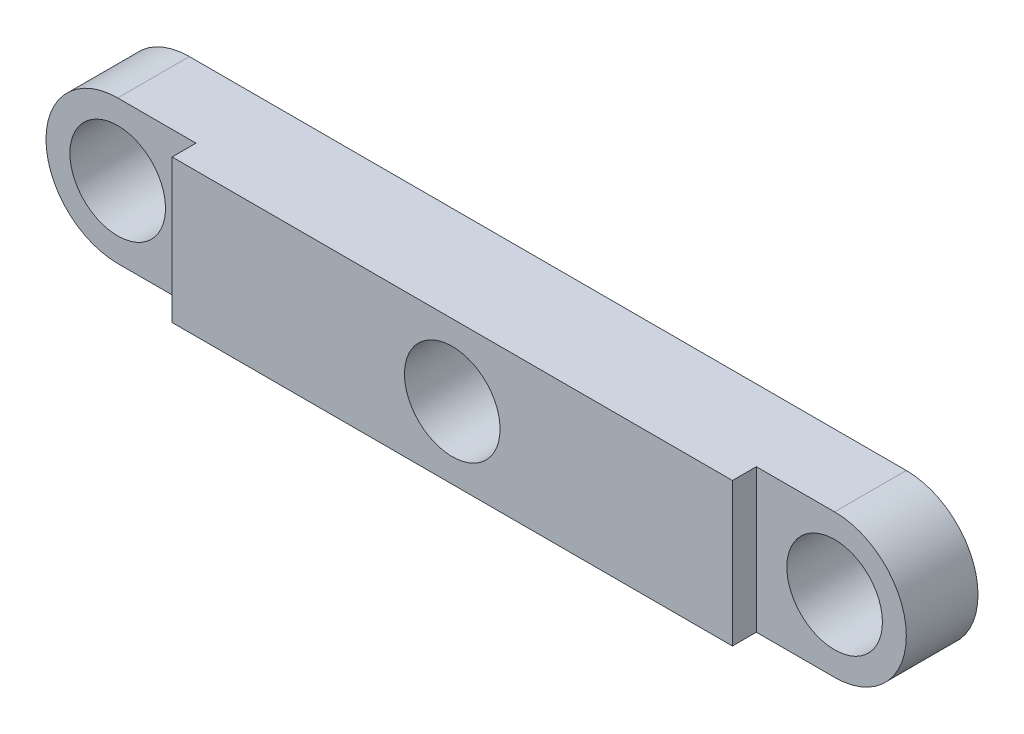
ISO-10303-21;
HEADER;
FILE_DESCRIPTION(('STEP AP214'),'2;1');
FILE_NAME('part.step','',(''),(''),'','','');
FILE_SCHEMA(('AUTOMOTIVE_DESIGN { 1 0 10303 214 1 1 1 1 }'));
ENDSEC;
DATA;
#1=APPLICATION_CONTEXT('core data for automotive mechanical design processes');
#2=APPLICATION_PROTOCOL_DEFINITION('international standard','automotive_design',2000,#1);
#3=PRODUCT_CONTEXT('',#1,'mechanical');
#4=PRODUCT('Part','Part','',(#3));
#5=PRODUCT_RELATED_PRODUCT_CATEGORY('part','',(#4));
#6=PRODUCT_DEFINITION_FORMATION('','',#4);
#7=PRODUCT_DEFINITION_CONTEXT('part definition',#1,'design');
#8=PRODUCT_DEFINITION('design','',#6,#7);
#9=PRODUCT_DEFINITION_SHAPE('','',#8);
#10=(LENGTH_UNIT() NAMED_UNIT(*) SI_UNIT(.MILLI.,.METRE.));
#11=(NAMED_UNIT(*) PLANE_ANGLE_UNIT() SI_UNIT($,.RADIAN.));
#12=(NAMED_UNIT(*) SI_UNIT($,.STERADIAN.) SOLID_ANGLE_UNIT());
#13=UNCERTAINTY_MEASURE_WITH_UNIT(LENGTH_MEASURE(1.E-05),#10,'distance_accuracy_value','');
#14=(GEOMETRIC_REPRESENTATION_CONTEXT(3) GLOBAL_UNCERTAINTY_ASSIGNED_CONTEXT((#13)) GLOBAL_UNIT_ASSIGNED_CONTEXT((#10,
#11,#12)) REPRESENTATION_CONTEXT('',''));
#15=CARTESIAN_POINT('',(0.,0.,0.));
#16=DIRECTION('',(0.,0.,1.));
#17=DIRECTION('',(1.,0.,0.));
#18=AXIS2_PLACEMENT_3D('',#15,#16,#17);
#19=CARTESIAN_POINT('',(75.,0.,10.));
#20=DIRECTION('',(0.,0.,-1.));
#21=DIRECTION('',(-1.,0.,0.));
#22=AXIS2_PLACEMENT_3D('',#19,#20,#21);
#23=CYLINDRICAL_SURFACE('',#22,15.);
#24=CARTESIAN_POINT('',(75.,0.,5.));
#25=DIRECTION('',(0.,0.,1.));
#26=DIRECTION('',(1.,0.,0.));
#27=AXIS2_PLACEMENT_3D('',#24,#25,#26);
#28=CIRCLE('',#27,15.);
#29=CARTESIAN_POINT('',(75.,-15.,5.));
#30=VERTEX_POINT('',#29);
#31=CARTESIAN_POINT('',(75.,15.,5.));
#32=VERTEX_POINT('',#31);
#33=EDGE_CURVE('E68',#30,#32,#28,.T.);
#34=ORIENTED_EDGE('',*,*,#33,.F.);
#35=DIRECTION('',(0.,0.,-1.));
#36=VECTOR('',#35,1.);
#37=CARTESIAN_POINT('',(75.,-15.,10.));
#38=LINE('',#37,#36);
#39=CARTESIAN_POINT('',(75.,-15.,-10.));
#40=VERTEX_POINT('',#39);
#41=EDGE_CURVE('E52',#30,#40,#38,.T.);
#42=ORIENTED_EDGE('',*,*,#41,.T.);
#43=CARTESIAN_POINT('',(75.,0.,-10.));
#44=DIRECTION('',(0.,0.,1.));
#45=DIRECTION('',(1.,0.,0.));
#46=AXIS2_PLACEMENT_3D('',#43,#44,#45);
#47=CIRCLE('',#46,15.);
#48=CARTESIAN_POINT('',(75.,15.,-10.));
#49=VERTEX_POINT('',#48);
#50=EDGE_CURVE('E174',#40,#49,#47,.T.);
#51=ORIENTED_EDGE('',*,*,#50,.T.);
#52=DIRECTION('',(0.,0.,-1.));
#53=VECTOR('',#52,1.);
#54=CARTESIAN_POINT('',(75.,15.,10.));
#55=LINE('',#54,#53);
#56=EDGE_CURVE('E180',#32,#49,#55,.T.);
#57=ORIENTED_EDGE('',*,*,#56,.F.);
#58=EDGE_LOOP('',(#34,#42,#51,#57));
#59=FACE_BOUND('',#58,.T.);
#60=ADVANCED_FACE('F43',(#59),#23,.T.);
#61=CARTESIAN_POINT('',(75.,0.,10.));
#62=DIRECTION('',(0.,0.,-1.));
#63=DIRECTION('',(-1.,0.,0.));
#64=AXIS2_PLACEMENT_3D('',#61,#62,#63);
#65=CYLINDRICAL_SURFACE('',#64,10.);
#66=CARTESIAN_POINT('',(75.,0.,-10.));
#67=DIRECTION('',(0.,0.,1.));
#68=DIRECTION('',(1.,0.,0.));
#69=AXIS2_PLACEMENT_3D('',#66,#67,#68);
#70=CIRCLE('',#69,10.);
#71=CARTESIAN_POINT('',(85.,0.,-10.));
#72=VERTEX_POINT('',#71);
#73=EDGE_CURVE('E150',#72,#72,#70,.T.);
#74=ORIENTED_EDGE('',*,*,#73,.F.);
#75=EDGE_LOOP('',(#74));
#76=FACE_BOUND('',#75,.T.);
#77=CARTESIAN_POINT('',(75.,0.,5.));
#78=DIRECTION('',(0.,0.,1.));
#79=DIRECTION('',(1.,0.,0.));
#80=AXIS2_PLACEMENT_3D('',#77,#78,#79);
#81=CIRCLE('',#80,10.);
#82=CARTESIAN_POINT('',(85.,0.,5.));
#83=VERTEX_POINT('',#82);
#84=EDGE_CURVE('E130',#83,#83,#81,.T.);
#85=ORIENTED_EDGE('',*,*,#84,.T.);
#86=EDGE_LOOP('',(#85));
#87=FACE_BOUND('',#86,.T.);
#88=ADVANCED_FACE('F185',(#76,#87),#65,.F.);
#89=CARTESIAN_POINT('',(-75.,0.,10.));
#90=DIRECTION('',(0.,0.,1.));
#91=DIRECTION('',(1.,0.,0.));
#92=AXIS2_PLACEMENT_3D('',#89,#90,#91);
#93=PLANE('',#92);
#94=DIRECTION('',(0.,1.,0.));
#95=VECTOR('',#94,1.);
#96=CARTESIAN_POINT('',(-58.6201110809115,15.,10.));
#97=LINE('',#96,#95);
#98=CARTESIAN_POINT('',(-58.6201110809115,-15.,10.));
#99=VERTEX_POINT('',#98);
#100=CARTESIAN_POINT('',(-58.6201110809115,15.,10.));
#101=VERTEX_POINT('',#100);
#102=EDGE_CURVE('E146',#99,#101,#97,.T.);
#103=ORIENTED_EDGE('',*,*,#102,.F.);
#104=DIRECTION('',(1.,0.,0.));
#105=VECTOR('',#104,1.);
#106=CARTESIAN_POINT('',(-75.,-15.,10.));
#107=LINE('',#106,#105);
#108=CARTESIAN_POINT('',(58.6201110809014,-15.,10.));
#109=VERTEX_POINT('',#108);
#110=EDGE_CURVE('E128',#99,#109,#107,.T.);
#111=ORIENTED_EDGE('',*,*,#110,.T.);
#112=DIRECTION('',(0.,-1.,0.));
#113=VECTOR('',#112,1.);
#114=CARTESIAN_POINT('',(58.6201110809014,15.,10.));
#115=LINE('',#114,#113);
#116=CARTESIAN_POINT('',(58.6201110809014,15.,10.));
#117=VERTEX_POINT('',#116);
#118=EDGE_CURVE('E137',#117,#109,#115,.T.);
#119=ORIENTED_EDGE('',*,*,#118,.F.);
#120=DIRECTION('',(-1.,0.,0.));
#121=VECTOR('',#120,1.);
#122=CARTESIAN_POINT('',(-75.,15.,10.));
#123=LINE('',#122,#121);
#124=EDGE_CURVE('E164',#117,#101,#123,.T.);
#125=ORIENTED_EDGE('',*,*,#124,.T.);
#126=EDGE_LOOP('',(#103,#111,#119,#125));
#127=FACE_BOUND('',#126,.T.);
#128=CARTESIAN_POINT('',(0.,0.,10.));
#129=DIRECTION('',(0.,0.,1.));
#130=DIRECTION('',(1.,0.,0.));
#131=AXIS2_PLACEMENT_3D('',#128,#129,#130);
#132=CIRCLE('',#131,10.);
#133=CARTESIAN_POINT('',(10.,0.,10.));
#134=VERTEX_POINT('',#133);
#135=EDGE_CURVE('E154',#134,#134,#132,.T.);
#136=ORIENTED_EDGE('',*,*,#135,.F.);
#137=EDGE_LOOP('',(#136));
#138=FACE_BOUND('',#137,.T.);
#139=ADVANCED_FACE('F210',(#127,#138),#93,.T.);
#140=CARTESIAN_POINT('',(-75.,0.,-10.));
#141=DIRECTION('',(0.,0.,1.));
#142=DIRECTION('',(1.,0.,0.));
#143=AXIS2_PLACEMENT_3D('',#140,#141,#142);
#144=PLANE('',#143);
#145=CARTESIAN_POINT('',(-75.,0.,-10.));
#146=DIRECTION('',(0.,0.,1.));
#147=DIRECTION('',(1.,0.,0.));
#148=AXIS2_PLACEMENT_3D('',#145,#146,#147);
#149=CIRCLE('',#148,15.);
#150=CARTESIAN_POINT('',(-75.,15.,-10.));
#151=VERTEX_POINT('',#150);
#152=CARTESIAN_POINT('',(-75.,-15.,-10.));
#153=VERTEX_POINT('',#152);
#154=EDGE_CURVE('E162',#151,#153,#149,.T.);
#155=ORIENTED_EDGE('',*,*,#154,.F.);
#156=DIRECTION('',(-1.,0.,0.));
#157=VECTOR('',#156,1.);
#158=CARTESIAN_POINT('',(-75.,15.,-10.));
#159=LINE('',#158,#157);
#160=EDGE_CURVE('E165',#49,#151,#159,.T.);
#161=ORIENTED_EDGE('',*,*,#160,.F.);
#162=ORIENTED_EDGE('',*,*,#50,.F.);
#163=DIRECTION('',(1.,0.,0.));
#164=VECTOR('',#163,1.);
#165=CARTESIAN_POINT('',(-75.,-15.,-10.));
#166=LINE('',#165,#164);
#167=EDGE_CURVE('E171',#153,#40,#166,.T.);
#168=ORIENTED_EDGE('',*,*,#167,.F.);
#169=EDGE_LOOP('',(#155,#161,#162,#168));
#170=FACE_BOUND('',#169,.T.);
#171=CARTESIAN_POINT('',(-75.,0.,-10.));
#172=DIRECTION('',(0.,0.,1.));
#173=DIRECTION('',(1.,0.,0.));
#174=AXIS2_PLACEMENT_3D('',#171,#172,#173);
#175=CIRCLE('',#174,9.99999999999999);
#176=CARTESIAN_POINT('',(-65.,0.,-10.));
#177=VERTEX_POINT('',#176);
#178=EDGE_CURVE('E157',#177,#177,#175,.T.);
#179=ORIENTED_EDGE('',*,*,#178,.T.);
#180=EDGE_LOOP('',(#179));
#181=FACE_BOUND('',#180,.T.);
#182=CARTESIAN_POINT('',(0.,0.,-10.));
#183=DIRECTION('',(0.,0.,1.));
#184=DIRECTION('',(1.,0.,0.));
#185=AXIS2_PLACEMENT_3D('',#182,#183,#184);
#186=CIRCLE('',#185,10.);
#187=CARTESIAN_POINT('',(10.,0.,-10.));
#188=VERTEX_POINT('',#187);
#189=EDGE_CURVE('E153',#188,#188,#186,.T.);
#190=ORIENTED_EDGE('',*,*,#189,.T.);
#191=EDGE_LOOP('',(#190));
#192=FACE_BOUND('',#191,.T.);
#193=ORIENTED_EDGE('',*,*,#73,.T.);
#194=EDGE_LOOP('',(#193));
#195=FACE_BOUND('',#194,.T.);
#196=ADVANCED_FACE('F222',(#170,#181,#192,#195),#144,.F.);
#197=CARTESIAN_POINT('',(-75.,0.,10.));
#198=DIRECTION('',(0.,0.,-1.));
#199=DIRECTION('',(-1.,0.,0.));
#200=AXIS2_PLACEMENT_3D('',#197,#198,#199);
#201=CYLINDRICAL_SURFACE('',#200,15.);
#202=DIRECTION('',(0.,0.,-1.));
#203=VECTOR('',#202,1.);
#204=CARTESIAN_POINT('',(-75.,-15.,10.));
#205=LINE('',#204,#203);
#206=CARTESIAN_POINT('',(-75.,-15.,5.));
#207=VERTEX_POINT('',#206);
#208=EDGE_CURVE('E11',#207,#153,#205,.T.);
#209=ORIENTED_EDGE('',*,*,#208,.F.);
#210=CARTESIAN_POINT('',(-75.,0.,5.));
#211=DIRECTION('',(0.,0.,-1.));
#212=DIRECTION('',(-1.,0.,0.));
#213=AXIS2_PLACEMENT_3D('',#210,#211,#212);
#214=CIRCLE('',#213,15.);
#215=CARTESIAN_POINT('',(-75.,15.,5.));
#216=VERTEX_POINT('',#215);
#217=EDGE_CURVE('E110',#207,#216,#214,.T.);
#218=ORIENTED_EDGE('',*,*,#217,.T.);
#219=DIRECTION('',(0.,0.,-1.));
#220=VECTOR('',#219,1.);
#221=CARTESIAN_POINT('',(-75.,15.,10.));
#222=LINE('',#221,#220);
#223=EDGE_CURVE('E168',#216,#151,#222,.T.);
#224=ORIENTED_EDGE('',*,*,#223,.T.);
#225=ORIENTED_EDGE('',*,*,#154,.T.);
#226=EDGE_LOOP('',(#209,#218,#224,#225));
#227=FACE_BOUND('',#226,.T.);
#228=ADVANCED_FACE('F45',(#227),#201,.T.);
#229=CARTESIAN_POINT('',(-75.,-15.,10.));
#230=DIRECTION('',(0.,1.,0.));
#231=DIRECTION('',(0.,0.,1.));
#232=AXIS2_PLACEMENT_3D('',#229,#230,#231);
#233=PLANE('',#232);
#234=ORIENTED_EDGE('',*,*,#110,.F.);
#235=DIRECTION('',(0.,0.,1.));
#236=VECTOR('',#235,1.);
#237=CARTESIAN_POINT('',(-58.6201110809115,-15.,5.));
#238=LINE('',#237,#236);
#239=CARTESIAN_POINT('',(-58.6201110809115,-15.,5.));
#240=VERTEX_POINT('',#239);
#241=EDGE_CURVE('E118',#240,#99,#238,.T.);
#242=ORIENTED_EDGE('',*,*,#241,.F.);
#243=DIRECTION('',(1.,0.,0.));
#244=VECTOR('',#243,1.);
#245=CARTESIAN_POINT('',(-58.6201110809115,-15.,5.));
#246=LINE('',#245,#244);
#247=EDGE_CURVE('E107',#207,#240,#246,.T.);
#248=ORIENTED_EDGE('',*,*,#247,.F.);
#249=ORIENTED_EDGE('',*,*,#208,.T.);
#250=ORIENTED_EDGE('',*,*,#167,.T.);
#251=ORIENTED_EDGE('',*,*,#41,.F.);
#252=DIRECTION('',(1.,0.,0.));
#253=VECTOR('',#252,1.);
#254=CARTESIAN_POINT('',(58.6201110809014,-15.,5.));
#255=LINE('',#254,#253);
#256=CARTESIAN_POINT('',(58.6201110809014,-15.,5.));
#257=VERTEX_POINT('',#256);
#258=EDGE_CURVE('E140',#257,#30,#255,.T.);
#259=ORIENTED_EDGE('',*,*,#258,.F.);
#260=DIRECTION('',(0.,0.,1.));
#261=VECTOR('',#260,1.);
#262=CARTESIAN_POINT('',(58.6201110809014,-15.,5.));
#263=LINE('',#262,#261);
#264=EDGE_CURVE('E144',#257,#109,#263,.T.);
#265=ORIENTED_EDGE('',*,*,#264,.T.);
#266=EDGE_LOOP('',(#234,#242,#248,#249,#250,#251,#259,#265));
#267=FACE_BOUND('',#266,.T.);
#268=ADVANCED_FACE('F125',(#267),#233,.F.);
#269=CARTESIAN_POINT('',(-75.,15.,10.));
#270=DIRECTION('',(0.,-1.,0.));
#271=DIRECTION('',(0.,0.,-1.));
#272=AXIS2_PLACEMENT_3D('',#269,#270,#271);
#273=PLANE('',#272);
#274=DIRECTION('',(-1.,0.,0.));
#275=VECTOR('',#274,1.);
#276=CARTESIAN_POINT('',(-93.8799027763311,15.,5.));
#277=LINE('',#276,#275);
#278=CARTESIAN_POINT('',(-58.6201110809115,15.,5.));
#279=VERTEX_POINT('',#278);
#280=EDGE_CURVE('E114',#279,#216,#277,.T.);
#281=ORIENTED_EDGE('',*,*,#280,.F.);
#282=DIRECTION('',(0.,0.,1.));
#283=VECTOR('',#282,1.);
#284=CARTESIAN_POINT('',(-58.6201110809115,15.,5.));
#285=LINE('',#284,#283);
#286=EDGE_CURVE('E121',#279,#101,#285,.T.);
#287=ORIENTED_EDGE('',*,*,#286,.T.);
#288=ORIENTED_EDGE('',*,*,#124,.F.);
#289=DIRECTION('',(0.,0.,1.));
#290=VECTOR('',#289,1.);
#291=CARTESIAN_POINT('',(58.6201110809014,15.,5.));
#292=LINE('',#291,#290);
#293=CARTESIAN_POINT('',(58.6201110809014,15.,5.));
#294=VERTEX_POINT('',#293);
#295=EDGE_CURVE('E142',#294,#117,#292,.T.);
#296=ORIENTED_EDGE('',*,*,#295,.F.);
#297=DIRECTION('',(-1.,0.,0.));
#298=VECTOR('',#297,1.);
#299=CARTESIAN_POINT('',(93.879902776321,15.,5.));
#300=LINE('',#299,#298);
#301=EDGE_CURVE('E134',#32,#294,#300,.T.);
#302=ORIENTED_EDGE('',*,*,#301,.F.);
#303=ORIENTED_EDGE('',*,*,#56,.T.);
#304=ORIENTED_EDGE('',*,*,#160,.T.);
#305=ORIENTED_EDGE('',*,*,#223,.F.);
#306=EDGE_LOOP('',(#281,#287,#288,#296,#302,#303,#304,#305));
#307=FACE_BOUND('',#306,.T.);
#308=ADVANCED_FACE('F214',(#307),#273,.F.);
#309=CARTESIAN_POINT('',(-75.,0.,10.));
#310=DIRECTION('',(0.,0.,-1.));
#311=DIRECTION('',(-1.,0.,0.));
#312=AXIS2_PLACEMENT_3D('',#309,#310,#311);
#313=CYLINDRICAL_SURFACE('',#312,9.99999999999999);
#314=CARTESIAN_POINT('',(-75.,0.,5.));
#315=DIRECTION('',(0.,0.,-1.));
#316=DIRECTION('',(-1.,0.,0.));
#317=AXIS2_PLACEMENT_3D('',#314,#315,#316);
#318=CIRCLE('',#317,9.99999999999999);
#319=CARTESIAN_POINT('',(-85.,0.,5.));
#320=VERTEX_POINT('',#319);
#321=EDGE_CURVE('E47',#320,#320,#318,.T.);
#322=ORIENTED_EDGE('',*,*,#321,.F.);
#323=EDGE_LOOP('',(#322));
#324=FACE_BOUND('',#323,.T.);
#325=ORIENTED_EDGE('',*,*,#178,.F.);
#326=EDGE_LOOP('',(#325));
#327=FACE_BOUND('',#326,.T.);
#328=ADVANCED_FACE('F199',(#324,#327),#313,.F.);
#329=CARTESIAN_POINT('',(0.,0.,10.));
#330=DIRECTION('',(0.,0.,-1.));
#331=DIRECTION('',(-1.,0.,0.));
#332=AXIS2_PLACEMENT_3D('',#329,#330,#331);
#333=CYLINDRICAL_SURFACE('',#332,10.);
#334=ORIENTED_EDGE('',*,*,#135,.T.);
#335=EDGE_LOOP('',(#334));
#336=FACE_BOUND('',#335,.T.);
#337=ORIENTED_EDGE('',*,*,#189,.F.);
#338=EDGE_LOOP('',(#337));
#339=FACE_BOUND('',#338,.T.);
#340=ADVANCED_FACE('F190',(#336,#339),#333,.F.);
#341=CARTESIAN_POINT('',(0.,0.,5.));
#342=DIRECTION('',(0.,0.,1.));
#343=DIRECTION('',(1.,0.,0.));
#344=AXIS2_PLACEMENT_3D('',#341,#342,#343);
#345=PLANE('',#344);
#346=ORIENTED_EDGE('',*,*,#84,.F.);
#347=EDGE_LOOP('',(#346));
#348=FACE_BOUND('',#347,.T.);
#349=ORIENTED_EDGE('',*,*,#33,.T.);
#350=ORIENTED_EDGE('',*,*,#301,.T.);
#351=DIRECTION('',(0.,-1.,0.));
#352=VECTOR('',#351,1.);
#353=CARTESIAN_POINT('',(58.6201110809014,15.,5.));
#354=LINE('',#353,#352);
#355=EDGE_CURVE('E136',#294,#257,#354,.T.);
#356=ORIENTED_EDGE('',*,*,#355,.T.);
#357=ORIENTED_EDGE('',*,*,#258,.T.);
#358=EDGE_LOOP('',(#349,#350,#356,#357));
#359=FACE_BOUND('',#358,.T.);
#360=ADVANCED_FACE('F187',(#348,#359),#345,.T.);
#361=CARTESIAN_POINT('',(58.6201110809014,15.,5.));
#362=DIRECTION('',(-1.,0.,0.));
#363=DIRECTION('',(0.,-1.,0.));
#364=AXIS2_PLACEMENT_3D('',#361,#362,#363);
#365=PLANE('',#364);
#366=ORIENTED_EDGE('',*,*,#118,.T.);
#367=ORIENTED_EDGE('',*,*,#264,.F.);
#368=ORIENTED_EDGE('',*,*,#355,.F.);
#369=ORIENTED_EDGE('',*,*,#295,.T.);
#370=EDGE_LOOP('',(#366,#367,#368,#369));
#371=FACE_BOUND('',#370,.T.);
#372=ADVANCED_FACE('F189',(#371),#365,.F.);
#373=CARTESIAN_POINT('',(0.,0.,5.));
#374=DIRECTION('',(0.,0.,-1.));
#375=DIRECTION('',(-1.,0.,0.));
#376=AXIS2_PLACEMENT_3D('',#373,#374,#375);
#377=PLANE('',#376);
#378=ORIENTED_EDGE('',*,*,#321,.T.);
#379=EDGE_LOOP('',(#378));
#380=FACE_BOUND('',#379,.T.);
#381=ORIENTED_EDGE('',*,*,#247,.T.);
#382=DIRECTION('',(0.,1.,0.));
#383=VECTOR('',#382,1.);
#384=CARTESIAN_POINT('',(-58.6201110809115,15.,5.));
#385=LINE('',#384,#383);
#386=EDGE_CURVE('E60',#240,#279,#385,.T.);
#387=ORIENTED_EDGE('',*,*,#386,.T.);
#388=ORIENTED_EDGE('',*,*,#280,.T.);
#389=ORIENTED_EDGE('',*,*,#217,.F.);
#390=EDGE_LOOP('',(#381,#387,#388,#389));
#391=FACE_BOUND('',#390,.T.);
#392=ADVANCED_FACE('F108',(#380,#391),#377,.F.);
#393=CARTESIAN_POINT('',(-58.6201110809115,15.,5.));
#394=DIRECTION('',(1.,0.,0.));
#395=DIRECTION('',(0.,0.,-1.));
#396=AXIS2_PLACEMENT_3D('',#393,#394,#395);
#397=PLANE('',#396);
#398=ORIENTED_EDGE('',*,*,#102,.T.);
#399=ORIENTED_EDGE('',*,*,#286,.F.);
#400=ORIENTED_EDGE('',*,*,#386,.F.);
#401=ORIENTED_EDGE('',*,*,#241,.T.);
#402=EDGE_LOOP('',(#398,#399,#400,#401));
#403=FACE_BOUND('',#402,.T.);
#404=ADVANCED_FACE('F117',(#403),#397,.F.);
#405=CLOSED_SHELL('',(#60,#88,#139,#196,#228,#268,#308,#328,#340,#360,#372,#392,#404));
#406=MANIFOLD_SOLID_BREP('B2',#405);
#407=ADVANCED_BREP_SHAPE_REPRESENTATION('',(#18,#406),#14);
#408=SHAPE_DEFINITION_REPRESENTATION(#9,#407);
ENDSEC;
END-ISO-10303-21;
